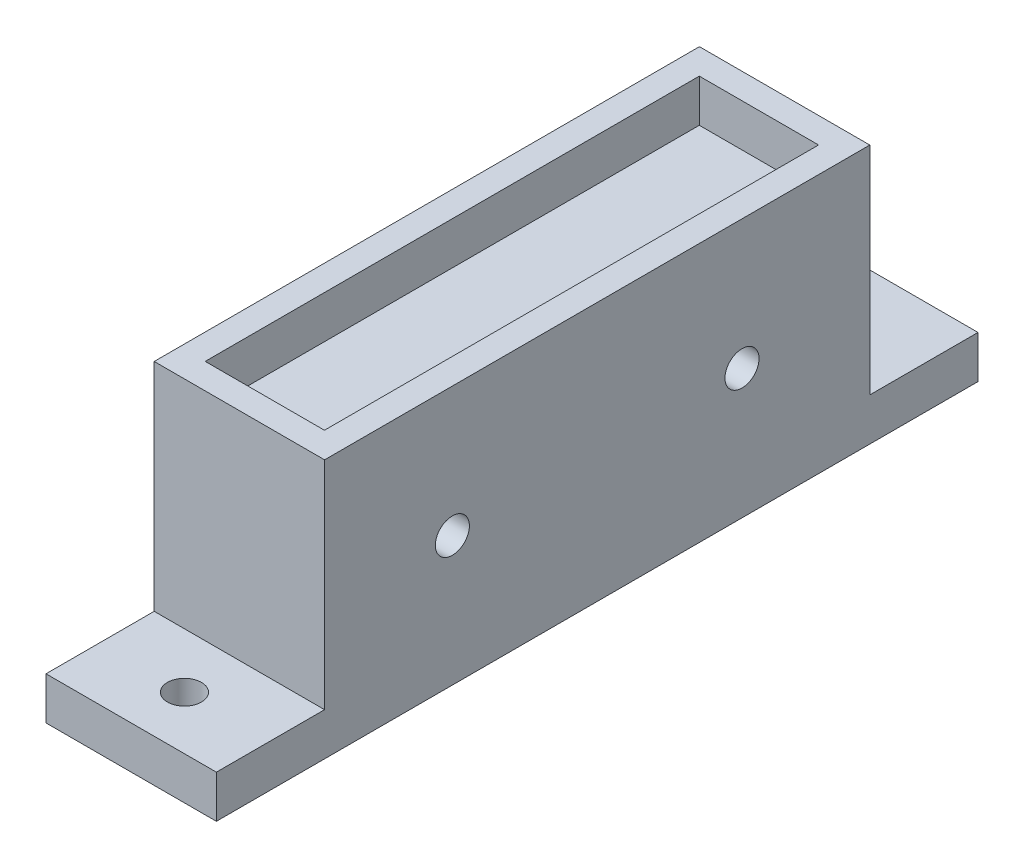
ISO-10303-21;
HEADER;
FILE_DESCRIPTION(('STEP AP214'),'2;1');
FILE_NAME('part.step','',(''),(''),'','','');
FILE_SCHEMA(('AUTOMOTIVE_DESIGN { 1 0 10303 214 1 1 1 1 }'));
ENDSEC;
DATA;
#1=APPLICATION_CONTEXT('core data for automotive mechanical design processes');
#2=APPLICATION_PROTOCOL_DEFINITION('international standard','automotive_design',2000,#1);
#3=PRODUCT_CONTEXT('',#1,'mechanical');
#4=PRODUCT('Part','Part','',(#3));
#5=PRODUCT_RELATED_PRODUCT_CATEGORY('part','',(#4));
#6=PRODUCT_DEFINITION_FORMATION('','',#4);
#7=PRODUCT_DEFINITION_CONTEXT('part definition',#1,'design');
#8=PRODUCT_DEFINITION('design','',#6,#7);
#9=PRODUCT_DEFINITION_SHAPE('','',#8);
#10=(LENGTH_UNIT() NAMED_UNIT(*) SI_UNIT(.MILLI.,.METRE.));
#11=(NAMED_UNIT(*) PLANE_ANGLE_UNIT() SI_UNIT($,.RADIAN.));
#12=(NAMED_UNIT(*) SI_UNIT($,.STERADIAN.) SOLID_ANGLE_UNIT());
#13=UNCERTAINTY_MEASURE_WITH_UNIT(LENGTH_MEASURE(1.E-05),#10,'distance_accuracy_value','');
#14=(GEOMETRIC_REPRESENTATION_CONTEXT(3) GLOBAL_UNCERTAINTY_ASSIGNED_CONTEXT((#13)) GLOBAL_UNIT_ASSIGNED_CONTEXT((#10,
#11,#12)) REPRESENTATION_CONTEXT('',''));
#15=CARTESIAN_POINT('',(0.,0.,0.));
#16=DIRECTION('',(0.,0.,1.));
#17=DIRECTION('',(1.,0.,0.));
#18=AXIS2_PLACEMENT_3D('',#15,#16,#17);
#19=CARTESIAN_POINT('',(20.,0.,-89.4));
#20=DIRECTION('',(0.,1.,0.));
#21=DIRECTION('',(0.,0.,1.));
#22=AXIS2_PLACEMENT_3D('',#19,#20,#21);
#23=PLANE('',#22);
#24=CARTESIAN_POINT('',(10.,0.,-83.15));
#25=DIRECTION('',(0.,1.,0.));
#26=DIRECTION('',(0.,0.,1.));
#27=AXIS2_PLACEMENT_3D('',#24,#25,#26);
#28=CIRCLE('',#27,2.);
#29=CARTESIAN_POINT('',(10.,0.,-81.15));
#30=VERTEX_POINT('',#29);
#31=EDGE_CURVE('E197',#30,#30,#28,.T.);
#32=ORIENTED_EDGE('',*,*,#31,.T.);
#33=EDGE_LOOP('',(#32));
#34=FACE_BOUND('',#33,.T.);
#35=CARTESIAN_POINT('',(10.,0.,-6.25000000000001));
#36=DIRECTION('',(0.,1.,0.));
#37=DIRECTION('',(0.,0.,1.));
#38=AXIS2_PLACEMENT_3D('',#35,#36,#37);
#39=CIRCLE('',#38,2.);
#40=CARTESIAN_POINT('',(10.,0.,-4.25000000000001));
#41=VERTEX_POINT('',#40);
#42=EDGE_CURVE('E203',#41,#41,#39,.T.);
#43=ORIENTED_EDGE('',*,*,#42,.T.);
#44=EDGE_LOOP('',(#43));
#45=FACE_BOUND('',#44,.T.);
#46=DIRECTION('',(0.,0.,-1.));
#47=VECTOR('',#46,1.);
#48=CARTESIAN_POINT('',(0.,0.,-89.4));
#49=LINE('',#48,#47);
#50=CARTESIAN_POINT('',(0.,0.,0.));
#51=VERTEX_POINT('',#50);
#52=CARTESIAN_POINT('',(0.,0.,-89.4));
#53=VERTEX_POINT('',#52);
#54=EDGE_CURVE('E155',#51,#53,#49,.T.);
#55=ORIENTED_EDGE('',*,*,#54,.T.);
#56=DIRECTION('',(-1.,0.,0.));
#57=VECTOR('',#56,1.);
#58=CARTESIAN_POINT('',(20.,0.,-89.4));
#59=LINE('',#58,#57);
#60=CARTESIAN_POINT('',(20.,0.,-89.4));
#61=VERTEX_POINT('',#60);
#62=EDGE_CURVE('E13',#61,#53,#59,.T.);
#63=ORIENTED_EDGE('',*,*,#62,.F.);
#64=DIRECTION('',(0.,0.,-1.));
#65=VECTOR('',#64,1.);
#66=CARTESIAN_POINT('',(20.,0.,-89.4));
#67=LINE('',#66,#65);
#68=CARTESIAN_POINT('',(20.,0.,0.));
#69=VERTEX_POINT('',#68);
#70=EDGE_CURVE('E171',#69,#61,#67,.T.);
#71=ORIENTED_EDGE('',*,*,#70,.F.);
#72=DIRECTION('',(-1.,0.,0.));
#73=VECTOR('',#72,1.);
#74=CARTESIAN_POINT('',(20.,0.,0.));
#75=LINE('',#74,#73);
#76=EDGE_CURVE('E151',#69,#51,#75,.T.);
#77=ORIENTED_EDGE('',*,*,#76,.T.);
#78=EDGE_LOOP('',(#55,#63,#71,#77));
#79=FACE_BOUND('',#78,.T.);
#80=ADVANCED_FACE('F45',(#34,#45,#79),#23,.F.);
#81=CARTESIAN_POINT('',(20.,5.,-89.4));
#82=DIRECTION('',(0.,0.,1.));
#83=DIRECTION('',(1.,0.,0.));
#84=AXIS2_PLACEMENT_3D('',#81,#82,#83);
#85=PLANE('',#84);
#86=DIRECTION('',(0.,1.,0.));
#87=VECTOR('',#86,1.);
#88=CARTESIAN_POINT('',(0.,5.,-89.4));
#89=LINE('',#88,#87);
#90=CARTESIAN_POINT('',(0.,5.,-89.4));
#91=VERTEX_POINT('',#90);
#92=EDGE_CURVE('E158',#53,#91,#89,.T.);
#93=ORIENTED_EDGE('',*,*,#92,.T.);
#94=DIRECTION('',(-1.,0.,0.));
#95=VECTOR('',#94,1.);
#96=CARTESIAN_POINT('',(20.,5.,-89.4));
#97=LINE('',#96,#95);
#98=CARTESIAN_POINT('',(20.,5.,-89.4));
#99=VERTEX_POINT('',#98);
#100=EDGE_CURVE('E53',#99,#91,#97,.T.);
#101=ORIENTED_EDGE('',*,*,#100,.F.);
#102=DIRECTION('',(0.,1.,0.));
#103=VECTOR('',#102,1.);
#104=CARTESIAN_POINT('',(20.,5.,-89.4));
#105=LINE('',#104,#103);
#106=EDGE_CURVE('E111',#61,#99,#105,.T.);
#107=ORIENTED_EDGE('',*,*,#106,.F.);
#108=ORIENTED_EDGE('',*,*,#62,.T.);
#109=EDGE_LOOP('',(#93,#101,#107,#108));
#110=FACE_BOUND('',#109,.T.);
#111=ADVANCED_FACE('F261',(#110),#85,.F.);
#112=CARTESIAN_POINT('',(20.,5.,-76.7));
#113=DIRECTION('',(0.,-1.,0.));
#114=DIRECTION('',(0.,0.,-1.));
#115=AXIS2_PLACEMENT_3D('',#112,#113,#114);
#116=PLANE('',#115);
#117=CARTESIAN_POINT('',(10.,5.,-83.15));
#118=DIRECTION('',(0.,1.,0.));
#119=DIRECTION('',(0.,0.,1.));
#120=AXIS2_PLACEMENT_3D('',#117,#118,#119);
#121=CIRCLE('',#120,2.);
#122=CARTESIAN_POINT('',(10.,5.,-81.15));
#123=VERTEX_POINT('',#122);
#124=EDGE_CURVE('E200',#123,#123,#121,.T.);
#125=ORIENTED_EDGE('',*,*,#124,.F.);
#126=EDGE_LOOP('',(#125));
#127=FACE_BOUND('',#126,.T.);
#128=DIRECTION('',(0.,0.,1.));
#129=VECTOR('',#128,1.);
#130=CARTESIAN_POINT('',(0.,5.,-76.7));
#131=LINE('',#130,#129);
#132=CARTESIAN_POINT('',(0.,5.,-76.7));
#133=VERTEX_POINT('',#132);
#134=EDGE_CURVE('E161',#91,#133,#131,.T.);
#135=ORIENTED_EDGE('',*,*,#134,.T.);
#136=DIRECTION('',(-1.,0.,0.));
#137=VECTOR('',#136,1.);
#138=CARTESIAN_POINT('',(20.,5.,-76.7));
#139=LINE('',#138,#137);
#140=CARTESIAN_POINT('',(20.,5.,-76.7));
#141=VERTEX_POINT('',#140);
#142=EDGE_CURVE('E178',#141,#133,#139,.T.);
#143=ORIENTED_EDGE('',*,*,#142,.F.);
#144=DIRECTION('',(0.,0.,1.));
#145=VECTOR('',#144,1.);
#146=CARTESIAN_POINT('',(20.,5.,-76.7));
#147=LINE('',#146,#145);
#148=EDGE_CURVE('E241',#99,#141,#147,.T.);
#149=ORIENTED_EDGE('',*,*,#148,.F.);
#150=ORIENTED_EDGE('',*,*,#100,.T.);
#151=EDGE_LOOP('',(#135,#143,#149,#150));
#152=FACE_BOUND('',#151,.T.);
#153=ADVANCED_FACE('F264',(#127,#152),#116,.F.);
#154=CARTESIAN_POINT('',(20.,30.4,-76.7));
#155=DIRECTION('',(0.,0.,1.));
#156=DIRECTION('',(1.,0.,0.));
#157=AXIS2_PLACEMENT_3D('',#154,#155,#156);
#158=PLANE('',#157);
#159=DIRECTION('',(0.,1.,0.));
#160=VECTOR('',#159,1.);
#161=CARTESIAN_POINT('',(0.,30.4,-76.7));
#162=LINE('',#161,#160);
#163=CARTESIAN_POINT('',(0.,30.4,-76.7));
#164=VERTEX_POINT('',#163);
#165=EDGE_CURVE('E163',#133,#164,#162,.T.);
#166=ORIENTED_EDGE('',*,*,#165,.T.);
#167=DIRECTION('',(-1.,0.,0.));
#168=VECTOR('',#167,1.);
#169=CARTESIAN_POINT('',(20.,30.4,-76.7));
#170=LINE('',#169,#168);
#171=CARTESIAN_POINT('',(20.,30.4,-76.7));
#172=VERTEX_POINT('',#171);
#173=EDGE_CURVE('E175',#172,#164,#170,.T.);
#174=ORIENTED_EDGE('',*,*,#173,.F.);
#175=DIRECTION('',(0.,1.,0.));
#176=VECTOR('',#175,1.);
#177=CARTESIAN_POINT('',(20.,30.4,-76.7));
#178=LINE('',#177,#176);
#179=EDGE_CURVE('E243',#141,#172,#178,.T.);
#180=ORIENTED_EDGE('',*,*,#179,.F.);
#181=ORIENTED_EDGE('',*,*,#142,.T.);
#182=EDGE_LOOP('',(#166,#174,#180,#181));
#183=FACE_BOUND('',#182,.T.);
#184=ADVANCED_FACE('F249',(#183),#158,.F.);
#185=CARTESIAN_POINT('',(20.,30.4,-12.7));
#186=DIRECTION('',(0.,-1.,0.));
#187=DIRECTION('',(0.,0.,-1.));
#188=AXIS2_PLACEMENT_3D('',#185,#186,#187);
#189=PLANE('',#188);
#190=DIRECTION('',(-1.,0.,0.));
#191=VECTOR('',#190,1.);
#192=CARTESIAN_POINT('',(2.98641600949148,30.4,-73.7));
#193=LINE('',#192,#191);
#194=CARTESIAN_POINT('',(16.9864160094915,30.4,-73.7));
#195=VERTEX_POINT('',#194);
#196=CARTESIAN_POINT('',(2.98641600949148,30.4,-73.7));
#197=VERTEX_POINT('',#196);
#198=EDGE_CURVE('E223',#195,#197,#193,.T.);
#199=ORIENTED_EDGE('',*,*,#198,.F.);
#200=DIRECTION('',(0.,0.,-1.));
#201=VECTOR('',#200,1.);
#202=CARTESIAN_POINT('',(16.9864160094915,30.4,-73.7));
#203=LINE('',#202,#201);
#204=CARTESIAN_POINT('',(16.9864160094915,30.4,-15.7));
#205=VERTEX_POINT('',#204);
#206=EDGE_CURVE('E61',#205,#195,#203,.T.);
#207=ORIENTED_EDGE('',*,*,#206,.F.);
#208=DIRECTION('',(1.,0.,0.));
#209=VECTOR('',#208,1.);
#210=CARTESIAN_POINT('',(2.98641600949149,30.4,-15.7));
#211=LINE('',#210,#209);
#212=CARTESIAN_POINT('',(2.98641600949149,30.4,-15.7));
#213=VERTEX_POINT('',#212);
#214=EDGE_CURVE('E212',#213,#205,#211,.T.);
#215=ORIENTED_EDGE('',*,*,#214,.F.);
#216=DIRECTION('',(0.,0.,1.));
#217=VECTOR('',#216,1.);
#218=CARTESIAN_POINT('',(2.98641600949148,30.4,-73.7));
#219=LINE('',#218,#217);
#220=EDGE_CURVE('E226',#197,#213,#219,.T.);
#221=ORIENTED_EDGE('',*,*,#220,.F.);
#222=EDGE_LOOP('',(#199,#207,#215,#221));
#223=FACE_BOUND('',#222,.T.);
#224=DIRECTION('',(0.,0.,1.));
#225=VECTOR('',#224,1.);
#226=CARTESIAN_POINT('',(0.,30.4,-12.7));
#227=LINE('',#226,#225);
#228=CARTESIAN_POINT('',(0.,30.4,-12.7));
#229=VERTEX_POINT('',#228);
#230=EDGE_CURVE('E165',#164,#229,#227,.T.);
#231=ORIENTED_EDGE('',*,*,#230,.T.);
#232=DIRECTION('',(-1.,0.,0.));
#233=VECTOR('',#232,1.);
#234=CARTESIAN_POINT('',(20.,30.4,-12.7));
#235=LINE('',#234,#233);
#236=CARTESIAN_POINT('',(20.,30.4,-12.7));
#237=VERTEX_POINT('',#236);
#238=EDGE_CURVE('E146',#237,#229,#235,.T.);
#239=ORIENTED_EDGE('',*,*,#238,.F.);
#240=DIRECTION('',(0.,0.,1.));
#241=VECTOR('',#240,1.);
#242=CARTESIAN_POINT('',(20.,30.4,-12.7));
#243=LINE('',#242,#241);
#244=EDGE_CURVE('E134',#172,#237,#243,.T.);
#245=ORIENTED_EDGE('',*,*,#244,.F.);
#246=ORIENTED_EDGE('',*,*,#173,.T.);
#247=EDGE_LOOP('',(#231,#239,#245,#246));
#248=FACE_BOUND('',#247,.T.);
#249=ADVANCED_FACE('F253',(#223,#248),#189,.F.);
#250=CARTESIAN_POINT('',(20.,5.,-12.7));
#251=DIRECTION('',(0.,0.,-1.));
#252=DIRECTION('',(-1.,0.,0.));
#253=AXIS2_PLACEMENT_3D('',#250,#251,#252);
#254=PLANE('',#253);
#255=DIRECTION('',(0.,-1.,0.));
#256=VECTOR('',#255,1.);
#257=CARTESIAN_POINT('',(0.,5.,-12.7));
#258=LINE('',#257,#256);
#259=CARTESIAN_POINT('',(0.,5.,-12.7));
#260=VERTEX_POINT('',#259);
#261=EDGE_CURVE('E143',#229,#260,#258,.T.);
#262=ORIENTED_EDGE('',*,*,#261,.T.);
#263=DIRECTION('',(-1.,0.,0.));
#264=VECTOR('',#263,1.);
#265=CARTESIAN_POINT('',(20.,5.,-12.7));
#266=LINE('',#265,#264);
#267=CARTESIAN_POINT('',(20.,5.,-12.7));
#268=VERTEX_POINT('',#267);
#269=EDGE_CURVE('E140',#268,#260,#266,.T.);
#270=ORIENTED_EDGE('',*,*,#269,.F.);
#271=DIRECTION('',(0.,-1.,0.));
#272=VECTOR('',#271,1.);
#273=CARTESIAN_POINT('',(20.,5.,-12.7));
#274=LINE('',#273,#272);
#275=EDGE_CURVE('E127',#237,#268,#274,.T.);
#276=ORIENTED_EDGE('',*,*,#275,.F.);
#277=ORIENTED_EDGE('',*,*,#238,.T.);
#278=EDGE_LOOP('',(#262,#270,#276,#277));
#279=FACE_BOUND('',#278,.T.);
#280=ADVANCED_FACE('F141',(#279),#254,.F.);
#281=CARTESIAN_POINT('',(20.,5.,0.));
#282=DIRECTION('',(0.,-1.,0.));
#283=DIRECTION('',(0.,0.,-1.));
#284=AXIS2_PLACEMENT_3D('',#281,#282,#283);
#285=PLANE('',#284);
#286=CARTESIAN_POINT('',(10.,5.,-6.25000000000001));
#287=DIRECTION('',(0.,1.,0.));
#288=DIRECTION('',(0.,0.,1.));
#289=AXIS2_PLACEMENT_3D('',#286,#287,#288);
#290=CIRCLE('',#289,2.);
#291=CARTESIAN_POINT('',(10.,5.,-4.25000000000001));
#292=VERTEX_POINT('',#291);
#293=EDGE_CURVE('E188',#292,#292,#290,.T.);
#294=ORIENTED_EDGE('',*,*,#293,.F.);
#295=EDGE_LOOP('',(#294));
#296=FACE_BOUND('',#295,.T.);
#297=DIRECTION('',(0.,0.,1.));
#298=VECTOR('',#297,1.);
#299=CARTESIAN_POINT('',(0.,5.,0.));
#300=LINE('',#299,#298);
#301=CARTESIAN_POINT('',(0.,5.,0.));
#302=VERTEX_POINT('',#301);
#303=EDGE_CURVE('E168',#260,#302,#300,.T.);
#304=ORIENTED_EDGE('',*,*,#303,.T.);
#305=DIRECTION('',(-1.,0.,0.));
#306=VECTOR('',#305,1.);
#307=CARTESIAN_POINT('',(20.,5.,0.));
#308=LINE('',#307,#306);
#309=CARTESIAN_POINT('',(20.,5.,0.));
#310=VERTEX_POINT('',#309);
#311=EDGE_CURVE('E147',#310,#302,#308,.T.);
#312=ORIENTED_EDGE('',*,*,#311,.F.);
#313=DIRECTION('',(0.,0.,1.));
#314=VECTOR('',#313,1.);
#315=CARTESIAN_POINT('',(20.,5.,0.));
#316=LINE('',#315,#314);
#317=EDGE_CURVE('E131',#268,#310,#316,.T.);
#318=ORIENTED_EDGE('',*,*,#317,.F.);
#319=ORIENTED_EDGE('',*,*,#269,.T.);
#320=EDGE_LOOP('',(#304,#312,#318,#319));
#321=FACE_BOUND('',#320,.T.);
#322=ADVANCED_FACE('F149',(#296,#321),#285,.F.);
#323=CARTESIAN_POINT('',(20.,0.,0.));
#324=DIRECTION('',(0.,0.,-1.));
#325=DIRECTION('',(-1.,0.,0.));
#326=AXIS2_PLACEMENT_3D('',#323,#324,#325);
#327=PLANE('',#326);
#328=DIRECTION('',(0.,-1.,0.));
#329=VECTOR('',#328,1.);
#330=CARTESIAN_POINT('',(0.,0.,0.));
#331=LINE('',#330,#329);
#332=EDGE_CURVE('E103',#302,#51,#331,.T.);
#333=ORIENTED_EDGE('',*,*,#332,.T.);
#334=ORIENTED_EDGE('',*,*,#76,.F.);
#335=DIRECTION('',(0.,-1.,0.));
#336=VECTOR('',#335,1.);
#337=CARTESIAN_POINT('',(20.,0.,0.));
#338=LINE('',#337,#336);
#339=EDGE_CURVE('E70',#310,#69,#338,.T.);
#340=ORIENTED_EDGE('',*,*,#339,.F.);
#341=ORIENTED_EDGE('',*,*,#311,.T.);
#342=EDGE_LOOP('',(#333,#334,#340,#341));
#343=FACE_BOUND('',#342,.T.);
#344=ADVANCED_FACE('F257',(#343),#327,.F.);
#345=CARTESIAN_POINT('',(20.,0.,0.));
#346=DIRECTION('',(-1.,0.,0.));
#347=DIRECTION('',(0.,0.,1.));
#348=AXIS2_PLACEMENT_3D('',#345,#346,#347);
#349=PLANE('',#348);
#350=CARTESIAN_POINT('',(20.,15.2,-27.7));
#351=DIRECTION('',(1.,0.,0.));
#352=DIRECTION('',(0.,0.,-1.));
#353=AXIS2_PLACEMENT_3D('',#350,#351,#352);
#354=CIRCLE('',#353,2.);
#355=CARTESIAN_POINT('',(20.,15.2,-29.7));
#356=VERTEX_POINT('',#355);
#357=EDGE_CURVE('E184',#356,#356,#354,.T.);
#358=ORIENTED_EDGE('',*,*,#357,.F.);
#359=EDGE_LOOP('',(#358));
#360=FACE_BOUND('',#359,.T.);
#361=CARTESIAN_POINT('',(20.,15.2,-61.7));
#362=DIRECTION('',(1.,0.,0.));
#363=DIRECTION('',(0.,0.,-1.));
#364=AXIS2_PLACEMENT_3D('',#361,#362,#363);
#365=CIRCLE('',#364,2.);
#366=CARTESIAN_POINT('',(20.,15.2,-63.7));
#367=VERTEX_POINT('',#366);
#368=EDGE_CURVE('E190',#367,#367,#365,.T.);
#369=ORIENTED_EDGE('',*,*,#368,.F.);
#370=EDGE_LOOP('',(#369));
#371=FACE_BOUND('',#370,.T.);
#372=ORIENTED_EDGE('',*,*,#70,.T.);
#373=ORIENTED_EDGE('',*,*,#106,.T.);
#374=ORIENTED_EDGE('',*,*,#148,.T.);
#375=ORIENTED_EDGE('',*,*,#179,.T.);
#376=ORIENTED_EDGE('',*,*,#244,.T.);
#377=ORIENTED_EDGE('',*,*,#275,.T.);
#378=ORIENTED_EDGE('',*,*,#317,.T.);
#379=ORIENTED_EDGE('',*,*,#339,.T.);
#380=EDGE_LOOP('',(#372,#373,#374,#375,#376,#377,#378,#379));
#381=FACE_BOUND('',#380,.T.);
#382=ADVANCED_FACE('F129',(#360,#371,#381),#349,.F.);
#383=CARTESIAN_POINT('',(0.,0.,0.));
#384=DIRECTION('',(-1.,0.,0.));
#385=DIRECTION('',(0.,0.,1.));
#386=AXIS2_PLACEMENT_3D('',#383,#384,#385);
#387=PLANE('',#386);
#388=CARTESIAN_POINT('',(0.,15.2,-27.7));
#389=DIRECTION('',(-1.,0.,0.));
#390=DIRECTION('',(0.,0.,1.));
#391=AXIS2_PLACEMENT_3D('',#388,#389,#390);
#392=CIRCLE('',#391,2.);
#393=CARTESIAN_POINT('',(0.,15.2,-25.7));
#394=VERTEX_POINT('',#393);
#395=EDGE_CURVE('E48',#394,#394,#392,.F.);
#396=ORIENTED_EDGE('',*,*,#395,.T.);
#397=EDGE_LOOP('',(#396));
#398=FACE_BOUND('',#397,.T.);
#399=CARTESIAN_POINT('',(0.,15.2,-61.7));
#400=DIRECTION('',(-1.,0.,0.));
#401=DIRECTION('',(0.,0.,1.));
#402=AXIS2_PLACEMENT_3D('',#399,#400,#401);
#403=CIRCLE('',#402,2.);
#404=CARTESIAN_POINT('',(0.,15.2,-59.7));
#405=VERTEX_POINT('',#404);
#406=EDGE_CURVE('E182',#405,#405,#403,.F.);
#407=ORIENTED_EDGE('',*,*,#406,.T.);
#408=EDGE_LOOP('',(#407));
#409=FACE_BOUND('',#408,.T.);
#410=ORIENTED_EDGE('',*,*,#54,.F.);
#411=ORIENTED_EDGE('',*,*,#332,.F.);
#412=ORIENTED_EDGE('',*,*,#303,.F.);
#413=ORIENTED_EDGE('',*,*,#261,.F.);
#414=ORIENTED_EDGE('',*,*,#230,.F.);
#415=ORIENTED_EDGE('',*,*,#165,.F.);
#416=ORIENTED_EDGE('',*,*,#134,.F.);
#417=ORIENTED_EDGE('',*,*,#92,.F.);
#418=EDGE_LOOP('',(#410,#411,#412,#413,#414,#415,#416,#417));
#419=FACE_BOUND('',#418,.T.);
#420=ADVANCED_FACE('F256',(#398,#409,#419),#387,.T.);
#421=CARTESIAN_POINT('',(16.9864160094915,25.4,-73.7));
#422=DIRECTION('',(1.,0.,0.));
#423=DIRECTION('',(0.,0.,-1.));
#424=AXIS2_PLACEMENT_3D('',#421,#422,#423);
#425=PLANE('',#424);
#426=ORIENTED_EDGE('',*,*,#206,.T.);
#427=DIRECTION('',(0.,1.,0.));
#428=VECTOR('',#427,1.);
#429=CARTESIAN_POINT('',(16.9864160094915,25.4,-73.7));
#430=LINE('',#429,#428);
#431=CARTESIAN_POINT('',(16.9864160094915,25.4,-73.7));
#432=VERTEX_POINT('',#431);
#433=EDGE_CURVE('E221',#432,#195,#430,.T.);
#434=ORIENTED_EDGE('',*,*,#433,.F.);
#435=DIRECTION('',(0.,0.,-1.));
#436=VECTOR('',#435,1.);
#437=CARTESIAN_POINT('',(16.9864160094915,25.4,-73.7));
#438=LINE('',#437,#436);
#439=CARTESIAN_POINT('',(16.9864160094915,25.4,-15.7));
#440=VERTEX_POINT('',#439);
#441=EDGE_CURVE('E208',#440,#432,#438,.T.);
#442=ORIENTED_EDGE('',*,*,#441,.F.);
#443=DIRECTION('',(0.,1.,0.));
#444=VECTOR('',#443,1.);
#445=CARTESIAN_POINT('',(16.9864160094915,25.4,-15.7));
#446=LINE('',#445,#444);
#447=EDGE_CURVE('E159',#440,#205,#446,.T.);
#448=ORIENTED_EDGE('',*,*,#447,.T.);
#449=EDGE_LOOP('',(#426,#434,#442,#448));
#450=FACE_BOUND('',#449,.T.);
#451=ADVANCED_FACE('F326',(#450),#425,.F.);
#452=CARTESIAN_POINT('',(2.98641600949149,25.4,-15.7));
#453=DIRECTION('',(0.,0.,1.));
#454=DIRECTION('',(1.,0.,0.));
#455=AXIS2_PLACEMENT_3D('',#452,#453,#454);
#456=PLANE('',#455);
#457=ORIENTED_EDGE('',*,*,#214,.T.);
#458=ORIENTED_EDGE('',*,*,#447,.F.);
#459=DIRECTION('',(1.,0.,0.));
#460=VECTOR('',#459,1.);
#461=CARTESIAN_POINT('',(2.98641600949149,25.4,-15.7));
#462=LINE('',#461,#460);
#463=CARTESIAN_POINT('',(2.98641600949149,25.4,-15.7));
#464=VERTEX_POINT('',#463);
#465=EDGE_CURVE('E218',#464,#440,#462,.T.);
#466=ORIENTED_EDGE('',*,*,#465,.F.);
#467=DIRECTION('',(0.,1.,0.));
#468=VECTOR('',#467,1.);
#469=CARTESIAN_POINT('',(2.98641600949149,25.4,-15.7));
#470=LINE('',#469,#468);
#471=EDGE_CURVE('E232',#464,#213,#470,.T.);
#472=ORIENTED_EDGE('',*,*,#471,.T.);
#473=EDGE_LOOP('',(#457,#458,#466,#472));
#474=FACE_BOUND('',#473,.T.);
#475=ADVANCED_FACE('F329',(#474),#456,.F.);
#476=CARTESIAN_POINT('',(2.98641600949148,25.4,-73.7));
#477=DIRECTION('',(-1.,0.,0.));
#478=DIRECTION('',(0.,0.,1.));
#479=AXIS2_PLACEMENT_3D('',#476,#477,#478);
#480=PLANE('',#479);
#481=ORIENTED_EDGE('',*,*,#220,.T.);
#482=ORIENTED_EDGE('',*,*,#471,.F.);
#483=DIRECTION('',(0.,0.,1.));
#484=VECTOR('',#483,1.);
#485=CARTESIAN_POINT('',(2.98641600949148,25.4,-73.7));
#486=LINE('',#485,#484);
#487=CARTESIAN_POINT('',(2.98641600949148,25.4,-73.7));
#488=VERTEX_POINT('',#487);
#489=EDGE_CURVE('E215',#488,#464,#486,.T.);
#490=ORIENTED_EDGE('',*,*,#489,.F.);
#491=DIRECTION('',(0.,1.,0.));
#492=VECTOR('',#491,1.);
#493=CARTESIAN_POINT('',(2.98641600949148,25.4,-73.7));
#494=LINE('',#493,#492);
#495=EDGE_CURVE('E235',#488,#197,#494,.T.);
#496=ORIENTED_EDGE('',*,*,#495,.T.);
#497=EDGE_LOOP('',(#481,#482,#490,#496));
#498=FACE_BOUND('',#497,.T.);
#499=ADVANCED_FACE('F330',(#498),#480,.F.);
#500=CARTESIAN_POINT('',(2.98641600949148,25.4,-73.7));
#501=DIRECTION('',(0.,0.,-1.));
#502=DIRECTION('',(-1.,0.,0.));
#503=AXIS2_PLACEMENT_3D('',#500,#501,#502);
#504=PLANE('',#503);
#505=ORIENTED_EDGE('',*,*,#198,.T.);
#506=ORIENTED_EDGE('',*,*,#495,.F.);
#507=DIRECTION('',(-1.,0.,0.));
#508=VECTOR('',#507,1.);
#509=CARTESIAN_POINT('',(2.98641600949148,25.4,-73.7));
#510=LINE('',#509,#508);
#511=EDGE_CURVE('E211',#432,#488,#510,.T.);
#512=ORIENTED_EDGE('',*,*,#511,.F.);
#513=ORIENTED_EDGE('',*,*,#433,.T.);
#514=EDGE_LOOP('',(#505,#506,#512,#513));
#515=FACE_BOUND('',#514,.T.);
#516=ADVANCED_FACE('F310',(#515),#504,.F.);
#517=CARTESIAN_POINT('',(0.,25.4,0.));
#518=DIRECTION('',(0.,1.,0.));
#519=DIRECTION('',(0.,0.,1.));
#520=AXIS2_PLACEMENT_3D('',#517,#518,#519);
#521=PLANE('',#520);
#522=ORIENTED_EDGE('',*,*,#441,.T.);
#523=ORIENTED_EDGE('',*,*,#511,.T.);
#524=ORIENTED_EDGE('',*,*,#489,.T.);
#525=ORIENTED_EDGE('',*,*,#465,.T.);
#526=EDGE_LOOP('',(#522,#523,#524,#525));
#527=FACE_BOUND('',#526,.T.);
#528=ADVANCED_FACE('F286',(#527),#521,.T.);
#529=CARTESIAN_POINT('',(10.,0.,-6.25000000000001));
#530=DIRECTION('',(0.,1.,0.));
#531=DIRECTION('',(0.,0.,1.));
#532=AXIS2_PLACEMENT_3D('',#529,#530,#531);
#533=CYLINDRICAL_SURFACE('',#532,2.);
#534=ORIENTED_EDGE('',*,*,#42,.F.);
#535=EDGE_LOOP('',(#534));
#536=FACE_BOUND('',#535,.T.);
#537=ORIENTED_EDGE('',*,*,#293,.T.);
#538=EDGE_LOOP('',(#537));
#539=FACE_BOUND('',#538,.T.);
#540=ADVANCED_FACE('F282',(#536,#539),#533,.F.);
#541=CARTESIAN_POINT('',(10.,0.,-83.15));
#542=DIRECTION('',(0.,1.,0.));
#543=DIRECTION('',(0.,0.,1.));
#544=AXIS2_PLACEMENT_3D('',#541,#542,#543);
#545=CYLINDRICAL_SURFACE('',#544,2.);
#546=ORIENTED_EDGE('',*,*,#31,.F.);
#547=EDGE_LOOP('',(#546));
#548=FACE_BOUND('',#547,.T.);
#549=ORIENTED_EDGE('',*,*,#124,.T.);
#550=EDGE_LOOP('',(#549));
#551=FACE_BOUND('',#550,.T.);
#552=ADVANCED_FACE('F285',(#548,#551),#545,.F.);
#553=CARTESIAN_POINT('',(20.,15.2,-61.7));
#554=DIRECTION('',(-1.,0.,0.));
#555=DIRECTION('',(0.,0.,1.));
#556=AXIS2_PLACEMENT_3D('',#553,#554,#555);
#557=CYLINDRICAL_SURFACE('',#556,2.);
#558=ORIENTED_EDGE('',*,*,#406,.F.);
#559=EDGE_LOOP('',(#558));
#560=FACE_BOUND('',#559,.T.);
#561=ORIENTED_EDGE('',*,*,#368,.T.);
#562=EDGE_LOOP('',(#561));
#563=FACE_BOUND('',#562,.T.);
#564=ADVANCED_FACE('F353',(#560,#563),#557,.F.);
#565=CARTESIAN_POINT('',(20.,15.2,-27.7));
#566=DIRECTION('',(-1.,0.,0.));
#567=DIRECTION('',(0.,0.,1.));
#568=AXIS2_PLACEMENT_3D('',#565,#566,#567);
#569=CYLINDRICAL_SURFACE('',#568,2.);
#570=ORIENTED_EDGE('',*,*,#395,.F.);
#571=EDGE_LOOP('',(#570));
#572=FACE_BOUND('',#571,.T.);
#573=ORIENTED_EDGE('',*,*,#357,.T.);
#574=EDGE_LOOP('',(#573));
#575=FACE_BOUND('',#574,.T.);
#576=ADVANCED_FACE('F351',(#572,#575),#569,.F.);
#577=CLOSED_SHELL('',(#80,#111,#153,#184,#249,#280,#322,#344,#382,#420,#451,#475,#499,#516,#528,
#540,#552,#564,#576));
#578=MANIFOLD_SOLID_BREP('B2',#577);
#579=ADVANCED_BREP_SHAPE_REPRESENTATION('',(#18,#578),#14);
#580=SHAPE_DEFINITION_REPRESENTATION(#9,#579);
ENDSEC;
END-ISO-10303-21;
